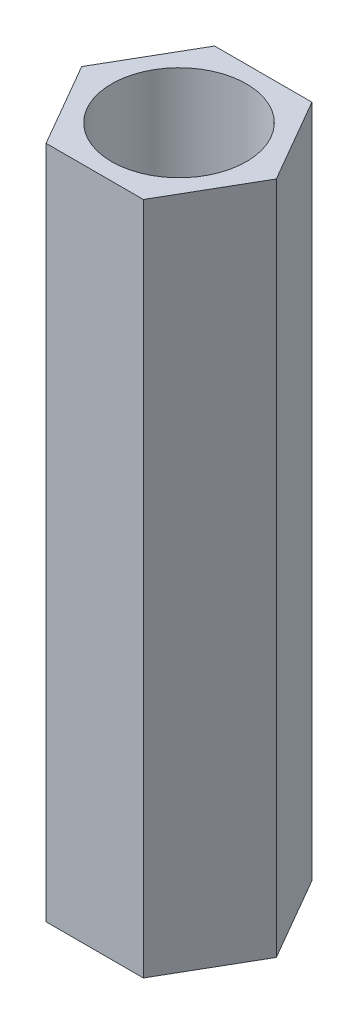
ISO-10303-21;
HEADER;
FILE_DESCRIPTION(('STEP AP214'),'2;1');
FILE_NAME('part.step','',(''),(''),'','','');
FILE_SCHEMA(('AUTOMOTIVE_DESIGN { 1 0 10303 214 1 1 1 1 }'));
ENDSEC;
DATA;
#1=APPLICATION_CONTEXT('core data for automotive mechanical design processes');
#2=APPLICATION_PROTOCOL_DEFINITION('international standard','automotive_design',2000,#1);
#3=PRODUCT_CONTEXT('',#1,'mechanical');
#4=PRODUCT('Part','Part','',(#3));
#5=PRODUCT_RELATED_PRODUCT_CATEGORY('part','',(#4));
#6=PRODUCT_DEFINITION_FORMATION('','',#4);
#7=PRODUCT_DEFINITION_CONTEXT('part definition',#1,'design');
#8=PRODUCT_DEFINITION('design','',#6,#7);
#9=PRODUCT_DEFINITION_SHAPE('','',#8);
#10=(LENGTH_UNIT() NAMED_UNIT(*) SI_UNIT(.MILLI.,.METRE.));
#11=(NAMED_UNIT(*) PLANE_ANGLE_UNIT() SI_UNIT($,.RADIAN.));
#12=(NAMED_UNIT(*) SI_UNIT($,.STERADIAN.) SOLID_ANGLE_UNIT());
#13=UNCERTAINTY_MEASURE_WITH_UNIT(LENGTH_MEASURE(1.E-05),#10,'distance_accuracy_value','');
#14=(GEOMETRIC_REPRESENTATION_CONTEXT(3) GLOBAL_UNCERTAINTY_ASSIGNED_CONTEXT((#13)) GLOBAL_UNIT_ASSIGNED_CONTEXT((#10,
#11,#12)) REPRESENTATION_CONTEXT('',''));
#15=CARTESIAN_POINT('',(0.,0.,0.));
#16=DIRECTION('',(0.,0.,1.));
#17=DIRECTION('',(1.,0.,0.));
#18=AXIS2_PLACEMENT_3D('',#15,#16,#17);
#19=CARTESIAN_POINT('',(0.,20.,0.));
#20=DIRECTION('',(0.,1.,0.));
#21=DIRECTION('',(0.,0.,1.));
#22=AXIS2_PLACEMENT_3D('',#19,#20,#21);
#23=PLANE('',#22);
#24=DIRECTION('',(-0.5,0.,-0.866025403784439));
#25=VECTOR('',#24,1.);
#26=CARTESIAN_POINT('',(2.88675134594813,20.,0.));
#27=LINE('',#26,#25);
#28=CARTESIAN_POINT('',(2.88675134594813,20.,0.));
#29=VERTEX_POINT('',#28);
#30=CARTESIAN_POINT('',(1.44337567297407,20.,-2.5));
#31=VERTEX_POINT('',#30);
#32=EDGE_CURVE('E133',#29,#31,#27,.T.);
#33=ORIENTED_EDGE('',*,*,#32,.T.);
#34=DIRECTION('',(-1.,0.,0.));
#35=VECTOR('',#34,1.);
#36=CARTESIAN_POINT('',(1.44337567297407,20.,-2.5));
#37=LINE('',#36,#35);
#38=CARTESIAN_POINT('',(-1.44337567297406,20.,-2.5));
#39=VERTEX_POINT('',#38);
#40=EDGE_CURVE('E91',#31,#39,#37,.T.);
#41=ORIENTED_EDGE('',*,*,#40,.T.);
#42=DIRECTION('',(-0.5,0.,0.866025403784438));
#43=VECTOR('',#42,1.);
#44=CARTESIAN_POINT('',(-1.44337567297406,20.,-2.5));
#45=LINE('',#44,#43);
#46=CARTESIAN_POINT('',(-2.88675134594813,20.,0.));
#47=VERTEX_POINT('',#46);
#48=EDGE_CURVE('E104',#39,#47,#45,.T.);
#49=ORIENTED_EDGE('',*,*,#48,.T.);
#50=DIRECTION('',(0.5,0.,0.866025403784439));
#51=VECTOR('',#50,1.);
#52=CARTESIAN_POINT('',(-2.88675134594813,20.,0.));
#53=LINE('',#52,#51);
#54=CARTESIAN_POINT('',(-1.44337567297407,20.,2.5));
#55=VERTEX_POINT('',#54);
#56=EDGE_CURVE('E98',#47,#55,#53,.T.);
#57=ORIENTED_EDGE('',*,*,#56,.T.);
#58=DIRECTION('',(1.,0.,0.));
#59=VECTOR('',#58,1.);
#60=CARTESIAN_POINT('',(-1.44337567297407,20.,2.5));
#61=LINE('',#60,#59);
#62=CARTESIAN_POINT('',(1.44337567297406,20.,2.5));
#63=VERTEX_POINT('',#62);
#64=EDGE_CURVE('E102',#55,#63,#61,.T.);
#65=ORIENTED_EDGE('',*,*,#64,.T.);
#66=DIRECTION('',(0.5,0.,-0.866025403784438));
#67=VECTOR('',#66,1.);
#68=CARTESIAN_POINT('',(1.44337567297406,20.,2.5));
#69=LINE('',#68,#67);
#70=EDGE_CURVE('E54',#63,#29,#69,.T.);
#71=ORIENTED_EDGE('',*,*,#70,.T.);
#72=EDGE_LOOP('',(#33,#41,#49,#57,#65,#71));
#73=FACE_BOUND('',#72,.T.);
#74=CARTESIAN_POINT('',(0.,20.,0.));
#75=DIRECTION('',(0.,1.,0.));
#76=DIRECTION('',(0.,0.,1.));
#77=AXIS2_PLACEMENT_3D('',#74,#75,#76);
#78=CIRCLE('',#77,2.);
#79=CARTESIAN_POINT('',(0.,20.,2.));
#80=VERTEX_POINT('',#79);
#81=EDGE_CURVE('E126',#80,#80,#78,.T.);
#82=ORIENTED_EDGE('',*,*,#81,.F.);
#83=EDGE_LOOP('',(#82));
#84=FACE_BOUND('',#83,.T.);
#85=ADVANCED_FACE('F37',(#73,#84),#23,.T.);
#86=CARTESIAN_POINT('',(0.,0.,0.));
#87=DIRECTION('',(0.,1.,0.));
#88=DIRECTION('',(0.,0.,1.));
#89=AXIS2_PLACEMENT_3D('',#86,#87,#88);
#90=PLANE('',#89);
#91=DIRECTION('',(-0.5,0.,-0.866025403784439));
#92=VECTOR('',#91,1.);
#93=CARTESIAN_POINT('',(2.88675134594813,0.,0.));
#94=LINE('',#93,#92);
#95=CARTESIAN_POINT('',(2.88675134594813,0.,0.));
#96=VERTEX_POINT('',#95);
#97=CARTESIAN_POINT('',(1.44337567297407,0.,-2.5));
#98=VERTEX_POINT('',#97);
#99=EDGE_CURVE('E122',#96,#98,#94,.T.);
#100=ORIENTED_EDGE('',*,*,#99,.F.);
#101=DIRECTION('',(0.5,0.,-0.866025403784438));
#102=VECTOR('',#101,1.);
#103=CARTESIAN_POINT('',(1.44337567297406,0.,2.5));
#104=LINE('',#103,#102);
#105=CARTESIAN_POINT('',(1.44337567297406,0.,2.5));
#106=VERTEX_POINT('',#105);
#107=EDGE_CURVE('E83',#106,#96,#104,.T.);
#108=ORIENTED_EDGE('',*,*,#107,.F.);
#109=DIRECTION('',(1.,0.,0.));
#110=VECTOR('',#109,1.);
#111=CARTESIAN_POINT('',(-1.44337567297407,0.,2.5));
#112=LINE('',#111,#110);
#113=CARTESIAN_POINT('',(-1.44337567297407,0.,2.5));
#114=VERTEX_POINT('',#113);
#115=EDGE_CURVE('E77',#114,#106,#112,.T.);
#116=ORIENTED_EDGE('',*,*,#115,.F.);
#117=DIRECTION('',(0.5,0.,0.866025403784439));
#118=VECTOR('',#117,1.);
#119=CARTESIAN_POINT('',(-2.88675134594813,0.,0.));
#120=LINE('',#119,#118);
#121=CARTESIAN_POINT('',(-2.88675134594813,0.,0.));
#122=VERTEX_POINT('',#121);
#123=EDGE_CURVE('E112',#122,#114,#120,.T.);
#124=ORIENTED_EDGE('',*,*,#123,.F.);
#125=DIRECTION('',(-0.5,0.,0.866025403784438));
#126=VECTOR('',#125,1.);
#127=CARTESIAN_POINT('',(-1.44337567297406,0.,-2.5));
#128=LINE('',#127,#126);
#129=CARTESIAN_POINT('',(-1.44337567297406,0.,-2.5));
#130=VERTEX_POINT('',#129);
#131=EDGE_CURVE('E128',#130,#122,#128,.T.);
#132=ORIENTED_EDGE('',*,*,#131,.F.);
#133=DIRECTION('',(-1.,0.,0.));
#134=VECTOR('',#133,1.);
#135=CARTESIAN_POINT('',(1.44337567297407,0.,-2.5));
#136=LINE('',#135,#134);
#137=EDGE_CURVE('E125',#98,#130,#136,.T.);
#138=ORIENTED_EDGE('',*,*,#137,.F.);
#139=EDGE_LOOP('',(#100,#108,#116,#124,#132,#138));
#140=FACE_BOUND('',#139,.T.);
#141=CARTESIAN_POINT('',(0.,0.,0.));
#142=DIRECTION('',(0.,1.,0.));
#143=DIRECTION('',(0.,0.,1.));
#144=AXIS2_PLACEMENT_3D('',#141,#142,#143);
#145=CIRCLE('',#144,2.);
#146=CARTESIAN_POINT('',(0.,0.,2.));
#147=VERTEX_POINT('',#146);
#148=EDGE_CURVE('E226',#147,#147,#145,.T.);
#149=ORIENTED_EDGE('',*,*,#148,.T.);
#150=EDGE_LOOP('',(#149));
#151=FACE_BOUND('',#150,.T.);
#152=ADVANCED_FACE('F142',(#140,#151),#90,.F.);
#153=CARTESIAN_POINT('',(2.88675134594813,20.,0.));
#154=DIRECTION('',(-0.866025403784439,0.,0.5));
#155=DIRECTION('',(0.5,0.,0.866025403784439));
#156=AXIS2_PLACEMENT_3D('',#153,#154,#155);
#157=PLANE('',#156);
#158=ORIENTED_EDGE('',*,*,#99,.T.);
#159=DIRECTION('',(0.,-1.,0.));
#160=VECTOR('',#159,1.);
#161=CARTESIAN_POINT('',(1.44337567297407,20.,-2.5));
#162=LINE('',#161,#160);
#163=EDGE_CURVE('E11',#31,#98,#162,.T.);
#164=ORIENTED_EDGE('',*,*,#163,.F.);
#165=ORIENTED_EDGE('',*,*,#32,.F.);
#166=DIRECTION('',(0.,-1.,0.));
#167=VECTOR('',#166,1.);
#168=CARTESIAN_POINT('',(2.88675134594813,20.,0.));
#169=LINE('',#168,#167);
#170=EDGE_CURVE('E118',#29,#96,#169,.T.);
#171=ORIENTED_EDGE('',*,*,#170,.T.);
#172=EDGE_LOOP('',(#158,#164,#165,#171));
#173=FACE_BOUND('',#172,.T.);
#174=ADVANCED_FACE('F39',(#173),#157,.F.);
#175=CARTESIAN_POINT('',(1.44337567297407,20.,-2.5));
#176=DIRECTION('',(0.,0.,1.));
#177=DIRECTION('',(1.,0.,0.));
#178=AXIS2_PLACEMENT_3D('',#175,#176,#177);
#179=PLANE('',#178);
#180=ORIENTED_EDGE('',*,*,#137,.T.);
#181=DIRECTION('',(0.,-1.,0.));
#182=VECTOR('',#181,1.);
#183=CARTESIAN_POINT('',(-1.44337567297406,20.,-2.5));
#184=LINE('',#183,#182);
#185=EDGE_CURVE('E46',#39,#130,#184,.T.);
#186=ORIENTED_EDGE('',*,*,#185,.F.);
#187=ORIENTED_EDGE('',*,*,#40,.F.);
#188=ORIENTED_EDGE('',*,*,#163,.T.);
#189=EDGE_LOOP('',(#180,#186,#187,#188));
#190=FACE_BOUND('',#189,.T.);
#191=ADVANCED_FACE('F167',(#190),#179,.F.);
#192=CARTESIAN_POINT('',(-1.44337567297406,20.,-2.5));
#193=DIRECTION('',(0.866025403784438,0.,0.5));
#194=DIRECTION('',(0.5,0.,-0.866025403784439));
#195=AXIS2_PLACEMENT_3D('',#192,#193,#194);
#196=PLANE('',#195);
#197=ORIENTED_EDGE('',*,*,#131,.T.);
#198=DIRECTION('',(0.,-1.,0.));
#199=VECTOR('',#198,1.);
#200=CARTESIAN_POINT('',(-2.88675134594813,20.,0.));
#201=LINE('',#200,#199);
#202=EDGE_CURVE('E113',#47,#122,#201,.T.);
#203=ORIENTED_EDGE('',*,*,#202,.F.);
#204=ORIENTED_EDGE('',*,*,#48,.F.);
#205=ORIENTED_EDGE('',*,*,#185,.T.);
#206=EDGE_LOOP('',(#197,#203,#204,#205));
#207=FACE_BOUND('',#206,.T.);
#208=ADVANCED_FACE('F139',(#207),#196,.F.);
#209=CARTESIAN_POINT('',(-2.88675134594813,20.,0.));
#210=DIRECTION('',(0.866025403784439,0.,-0.5));
#211=DIRECTION('',(-0.5,0.,-0.866025403784439));
#212=AXIS2_PLACEMENT_3D('',#209,#210,#211);
#213=PLANE('',#212);
#214=ORIENTED_EDGE('',*,*,#123,.T.);
#215=DIRECTION('',(0.,-1.,0.));
#216=VECTOR('',#215,1.);
#217=CARTESIAN_POINT('',(-1.44337567297407,20.,2.5));
#218=LINE('',#217,#216);
#219=EDGE_CURVE('E109',#55,#114,#218,.T.);
#220=ORIENTED_EDGE('',*,*,#219,.F.);
#221=ORIENTED_EDGE('',*,*,#56,.F.);
#222=ORIENTED_EDGE('',*,*,#202,.T.);
#223=EDGE_LOOP('',(#214,#220,#221,#222));
#224=FACE_BOUND('',#223,.T.);
#225=ADVANCED_FACE('F110',(#224),#213,.F.);
#226=CARTESIAN_POINT('',(-1.44337567297407,20.,2.5));
#227=DIRECTION('',(0.,0.,-1.));
#228=DIRECTION('',(-1.,0.,0.));
#229=AXIS2_PLACEMENT_3D('',#226,#227,#228);
#230=PLANE('',#229);
#231=ORIENTED_EDGE('',*,*,#115,.T.);
#232=DIRECTION('',(0.,-1.,0.));
#233=VECTOR('',#232,1.);
#234=CARTESIAN_POINT('',(1.44337567297406,20.,2.5));
#235=LINE('',#234,#233);
#236=EDGE_CURVE('E114',#63,#106,#235,.T.);
#237=ORIENTED_EDGE('',*,*,#236,.F.);
#238=ORIENTED_EDGE('',*,*,#64,.F.);
#239=ORIENTED_EDGE('',*,*,#219,.T.);
#240=EDGE_LOOP('',(#231,#237,#238,#239));
#241=FACE_BOUND('',#240,.T.);
#242=ADVANCED_FACE('F116',(#241),#230,.F.);
#243=CARTESIAN_POINT('',(1.44337567297406,20.,2.5));
#244=DIRECTION('',(-0.866025403784438,0.,-0.5));
#245=DIRECTION('',(-0.5,0.,0.866025403784438));
#246=AXIS2_PLACEMENT_3D('',#243,#244,#245);
#247=PLANE('',#246);
#248=ORIENTED_EDGE('',*,*,#107,.T.);
#249=ORIENTED_EDGE('',*,*,#170,.F.);
#250=ORIENTED_EDGE('',*,*,#70,.F.);
#251=ORIENTED_EDGE('',*,*,#236,.T.);
#252=EDGE_LOOP('',(#248,#249,#250,#251));
#253=FACE_BOUND('',#252,.T.);
#254=ADVANCED_FACE('F147',(#253),#247,.F.);
#255=CARTESIAN_POINT('',(0.,20.,0.));
#256=DIRECTION('',(0.,-1.,0.));
#257=DIRECTION('',(0.,0.,-1.));
#258=AXIS2_PLACEMENT_3D('',#255,#256,#257);
#259=CYLINDRICAL_SURFACE('',#258,2.);
#260=ORIENTED_EDGE('',*,*,#81,.T.);
#261=EDGE_LOOP('',(#260));
#262=FACE_BOUND('',#261,.T.);
#263=ORIENTED_EDGE('',*,*,#148,.F.);
#264=EDGE_LOOP('',(#263));
#265=FACE_BOUND('',#264,.T.);
#266=ADVANCED_FACE('F149',(#262,#265),#259,.F.);
#267=CLOSED_SHELL('',(#85,#152,#174,#191,#208,#225,#242,#254,#266));
#268=MANIFOLD_SOLID_BREP('B2',#267);
#269=ADVANCED_BREP_SHAPE_REPRESENTATION('',(#18,#268),#14);
#270=SHAPE_DEFINITION_REPRESENTATION(#9,#269);
ENDSEC;
END-ISO-10303-21;
